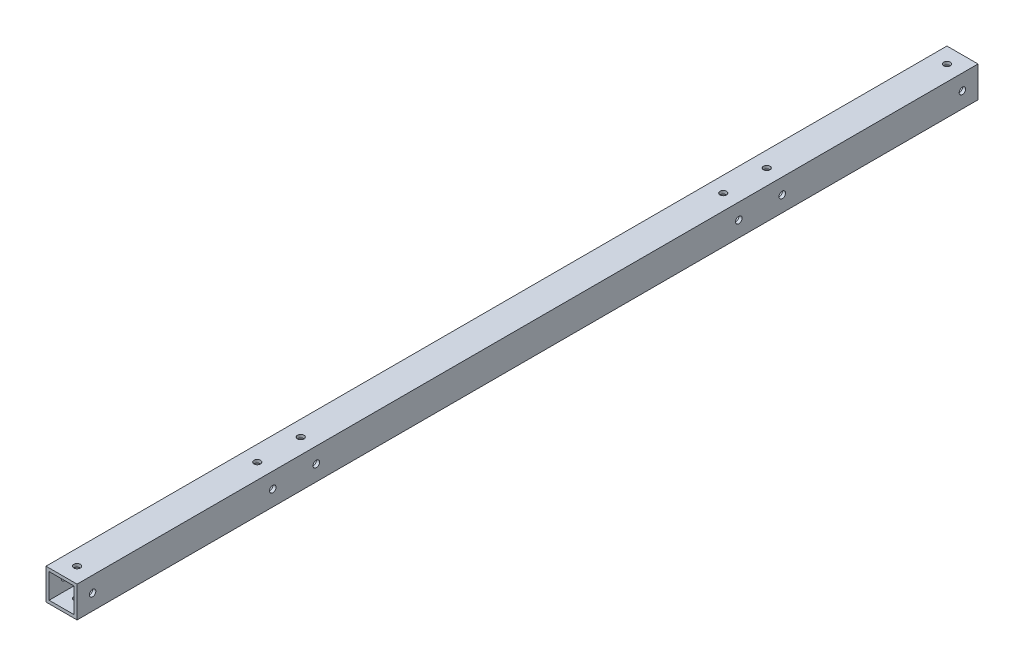
ISO-10303-21;
HEADER;
FILE_DESCRIPTION(('STEP AP214'),'2;1');
FILE_NAME('part.step','',(''),(''),'','','');
FILE_SCHEMA(('AUTOMOTIVE_DESIGN { 1 0 10303 214 1 1 1 1 }'));
ENDSEC;
DATA;
#1=APPLICATION_CONTEXT('core data for automotive mechanical design processes');
#2=APPLICATION_PROTOCOL_DEFINITION('international standard','automotive_design',2000,#1);
#3=PRODUCT_CONTEXT('',#1,'mechanical');
#4=PRODUCT('Part','Part','',(#3));
#5=PRODUCT_RELATED_PRODUCT_CATEGORY('part','',(#4));
#6=PRODUCT_DEFINITION_FORMATION('','',#4);
#7=PRODUCT_DEFINITION_CONTEXT('part definition',#1,'design');
#8=PRODUCT_DEFINITION('design','',#6,#7);
#9=PRODUCT_DEFINITION_SHAPE('','',#8);
#10=(LENGTH_UNIT() NAMED_UNIT(*) SI_UNIT(.MILLI.,.METRE.));
#11=(NAMED_UNIT(*) PLANE_ANGLE_UNIT() SI_UNIT($,.RADIAN.));
#12=(NAMED_UNIT(*) SI_UNIT($,.STERADIAN.) SOLID_ANGLE_UNIT());
#13=UNCERTAINTY_MEASURE_WITH_UNIT(LENGTH_MEASURE(1.E-05),#10,'distance_accuracy_value','');
#14=(GEOMETRIC_REPRESENTATION_CONTEXT(3) GLOBAL_UNCERTAINTY_ASSIGNED_CONTEXT((#13)) GLOBAL_UNIT_ASSIGNED_CONTEXT((#10,
#11,#12)) REPRESENTATION_CONTEXT('',''));
#15=CARTESIAN_POINT('',(0.,0.,0.));
#16=DIRECTION('',(0.,0.,1.));
#17=DIRECTION('',(1.,0.,0.));
#18=AXIS2_PLACEMENT_3D('',#15,#16,#17);
#19=CARTESIAN_POINT('',(0.,-10.,580.));
#20=DIRECTION('',(0.,1.,0.));
#21=DIRECTION('',(0.,0.,1.));
#22=AXIS2_PLACEMENT_3D('',#19,#20,#21);
#23=PLANE('',#22);
#24=CARTESIAN_POINT('',(0.,-10.,570.));
#25=DIRECTION('',(0.,-1.,0.));
#26=DIRECTION('',(0.,0.,-1.));
#27=AXIS2_PLACEMENT_3D('',#24,#25,#26);
#28=CIRCLE('',#27,2.1);
#29=CARTESIAN_POINT('',(0.,-10.,567.9));
#30=VERTEX_POINT('',#29);
#31=EDGE_CURVE('E209',#30,#30,#28,.T.);
#32=ORIENTED_EDGE('',*,*,#31,.F.);
#33=EDGE_LOOP('',(#32));
#34=FACE_BOUND('',#33,.T.);
#35=CARTESIAN_POINT('',(0.,-10.,454.));
#36=DIRECTION('',(0.,-1.,0.));
#37=DIRECTION('',(0.,0.,-1.));
#38=AXIS2_PLACEMENT_3D('',#35,#36,#37);
#39=CIRCLE('',#38,2.1);
#40=CARTESIAN_POINT('',(0.,-10.,451.9));
#41=VERTEX_POINT('',#40);
#42=EDGE_CURVE('E436',#41,#41,#39,.T.);
#43=ORIENTED_EDGE('',*,*,#42,.F.);
#44=EDGE_LOOP('',(#43));
#45=FACE_BOUND('',#44,.T.);
#46=CARTESIAN_POINT('',(0.,-10.,426.));
#47=DIRECTION('',(0.,-1.,0.));
#48=DIRECTION('',(0.,0.,-1.));
#49=AXIS2_PLACEMENT_3D('',#46,#47,#48);
#50=CIRCLE('',#49,2.1);
#51=CARTESIAN_POINT('',(0.,-10.,423.9));
#52=VERTEX_POINT('',#51);
#53=EDGE_CURVE('E443',#52,#52,#50,.T.);
#54=ORIENTED_EDGE('',*,*,#53,.F.);
#55=EDGE_LOOP('',(#54));
#56=FACE_BOUND('',#55,.T.);
#57=CARTESIAN_POINT('',(0.,-10.,10.));
#58=DIRECTION('',(0.,1.,0.));
#59=DIRECTION('',(0.,0.,1.));
#60=AXIS2_PLACEMENT_3D('',#57,#58,#59);
#61=CIRCLE('',#60,2.1);
#62=CARTESIAN_POINT('',(0.,-10.,12.1));
#63=VERTEX_POINT('',#62);
#64=EDGE_CURVE('E195',#63,#63,#61,.T.);
#65=ORIENTED_EDGE('',*,*,#64,.T.);
#66=EDGE_LOOP('',(#65));
#67=FACE_BOUND('',#66,.T.);
#68=CARTESIAN_POINT('',(0.,-10.,126.));
#69=DIRECTION('',(0.,1.,0.));
#70=DIRECTION('',(0.,0.,1.));
#71=AXIS2_PLACEMENT_3D('',#68,#69,#70);
#72=CIRCLE('',#71,2.1);
#73=CARTESIAN_POINT('',(0.,-10.,128.1));
#74=VERTEX_POINT('',#73);
#75=EDGE_CURVE('E244',#74,#74,#72,.T.);
#76=ORIENTED_EDGE('',*,*,#75,.T.);
#77=EDGE_LOOP('',(#76));
#78=FACE_BOUND('',#77,.T.);
#79=CARTESIAN_POINT('',(0.,-10.,154.));
#80=DIRECTION('',(0.,1.,0.));
#81=DIRECTION('',(0.,0.,1.));
#82=AXIS2_PLACEMENT_3D('',#79,#80,#81);
#83=CIRCLE('',#82,2.1);
#84=CARTESIAN_POINT('',(0.,-10.,156.1));
#85=VERTEX_POINT('',#84);
#86=EDGE_CURVE('E232',#85,#85,#83,.T.);
#87=ORIENTED_EDGE('',*,*,#86,.T.);
#88=EDGE_LOOP('',(#87));
#89=FACE_BOUND('',#88,.T.);
#90=DIRECTION('',(1.,0.,0.));
#91=VECTOR('',#90,1.);
#92=CARTESIAN_POINT('',(0.,-10.,0.));
#93=LINE('',#92,#91);
#94=CARTESIAN_POINT('',(-10.,-10.,0.));
#95=VERTEX_POINT('',#94);
#96=CARTESIAN_POINT('',(10.,-10.,0.));
#97=VERTEX_POINT('',#96);
#98=EDGE_CURVE('E162',#95,#97,#93,.T.);
#99=ORIENTED_EDGE('',*,*,#98,.T.);
#100=DIRECTION('',(0.,0.,-1.));
#101=VECTOR('',#100,1.);
#102=CARTESIAN_POINT('',(10.,-10.,580.));
#103=LINE('',#102,#101);
#104=CARTESIAN_POINT('',(10.,-10.,580.));
#105=VERTEX_POINT('',#104);
#106=EDGE_CURVE('E11',#105,#97,#103,.T.);
#107=ORIENTED_EDGE('',*,*,#106,.F.);
#108=DIRECTION('',(1.,0.,0.));
#109=VECTOR('',#108,1.);
#110=CARTESIAN_POINT('',(0.,-10.,580.));
#111=LINE('',#110,#109);
#112=CARTESIAN_POINT('',(-10.,-10.,580.));
#113=VERTEX_POINT('',#112);
#114=EDGE_CURVE('E125',#113,#105,#111,.T.);
#115=ORIENTED_EDGE('',*,*,#114,.F.);
#116=DIRECTION('',(0.,0.,-1.));
#117=VECTOR('',#116,1.);
#118=CARTESIAN_POINT('',(-10.,-10.,580.));
#119=LINE('',#118,#117);
#120=EDGE_CURVE('E64',#113,#95,#119,.T.);
#121=ORIENTED_EDGE('',*,*,#120,.T.);
#122=EDGE_LOOP('',(#99,#107,#115,#121));
#123=FACE_BOUND('',#122,.T.);
#124=ADVANCED_FACE('F44',(#34,#45,#56,#67,#78,#89,#123),#23,.F.);
#125=CARTESIAN_POINT('',(10.,0.,580.));
#126=DIRECTION('',(-1.,0.,0.));
#127=DIRECTION('',(0.,0.,1.));
#128=AXIS2_PLACEMENT_3D('',#125,#126,#127);
#129=PLANE('',#128);
#130=CARTESIAN_POINT('',(10.,0.,570.));
#131=DIRECTION('',(1.,0.,0.));
#132=DIRECTION('',(0.,0.,-1.));
#133=AXIS2_PLACEMENT_3D('',#130,#131,#132);
#134=CIRCLE('',#133,2.10000000000004);
#135=CARTESIAN_POINT('',(10.,0.,567.9));
#136=VERTEX_POINT('',#135);
#137=EDGE_CURVE('E710',#136,#136,#134,.T.);
#138=ORIENTED_EDGE('',*,*,#137,.F.);
#139=EDGE_LOOP('',(#138));
#140=FACE_BOUND('',#139,.T.);
#141=CARTESIAN_POINT('',(10.,0.,154.));
#142=DIRECTION('',(1.,0.,0.));
#143=DIRECTION('',(0.,0.,1.));
#144=AXIS2_PLACEMENT_3D('',#141,#142,#143);
#145=CIRCLE('',#144,2.09999999999999);
#146=CARTESIAN_POINT('',(10.,0.,156.1));
#147=VERTEX_POINT('',#146);
#148=EDGE_CURVE('E742',#147,#147,#145,.T.);
#149=ORIENTED_EDGE('',*,*,#148,.F.);
#150=EDGE_LOOP('',(#149));
#151=FACE_BOUND('',#150,.T.);
#152=CARTESIAN_POINT('',(10.,0.,10.));
#153=DIRECTION('',(1.,0.,0.));
#154=DIRECTION('',(0.,0.,-1.));
#155=AXIS2_PLACEMENT_3D('',#152,#153,#154);
#156=CIRCLE('',#155,2.1);
#157=CARTESIAN_POINT('',(10.,0.,7.9));
#158=VERTEX_POINT('',#157);
#159=EDGE_CURVE('E746',#158,#158,#156,.T.);
#160=ORIENTED_EDGE('',*,*,#159,.F.);
#161=EDGE_LOOP('',(#160));
#162=FACE_BOUND('',#161,.T.);
#163=CARTESIAN_POINT('',(10.,0.,426.));
#164=DIRECTION('',(1.,0.,0.));
#165=DIRECTION('',(0.,0.,-1.));
#166=AXIS2_PLACEMENT_3D('',#163,#164,#165);
#167=CIRCLE('',#166,2.09999999999999);
#168=CARTESIAN_POINT('',(10.,0.,423.9));
#169=VERTEX_POINT('',#168);
#170=EDGE_CURVE('E751',#169,#169,#167,.T.);
#171=ORIENTED_EDGE('',*,*,#170,.F.);
#172=EDGE_LOOP('',(#171));
#173=FACE_BOUND('',#172,.T.);
#174=CARTESIAN_POINT('',(10.,0.,454.));
#175=DIRECTION('',(1.,0.,0.));
#176=DIRECTION('',(0.,0.,-1.));
#177=AXIS2_PLACEMENT_3D('',#174,#175,#176);
#178=CIRCLE('',#177,2.09999999999999);
#179=CARTESIAN_POINT('',(10.,0.,451.9));
#180=VERTEX_POINT('',#179);
#181=EDGE_CURVE('E739',#180,#180,#178,.T.);
#182=ORIENTED_EDGE('',*,*,#181,.F.);
#183=EDGE_LOOP('',(#182));
#184=FACE_BOUND('',#183,.T.);
#185=CARTESIAN_POINT('',(10.,0.,126.));
#186=DIRECTION('',(1.,0.,0.));
#187=DIRECTION('',(0.,0.,1.));
#188=AXIS2_PLACEMENT_3D('',#185,#186,#187);
#189=CIRCLE('',#188,2.09999999999999);
#190=CARTESIAN_POINT('',(10.,0.,128.1));
#191=VERTEX_POINT('',#190);
#192=EDGE_CURVE('E730',#191,#191,#189,.T.);
#193=ORIENTED_EDGE('',*,*,#192,.F.);
#194=EDGE_LOOP('',(#193));
#195=FACE_BOUND('',#194,.T.);
#196=DIRECTION('',(0.,1.,0.));
#197=VECTOR('',#196,1.);
#198=CARTESIAN_POINT('',(10.,0.,0.));
#199=LINE('',#198,#197);
#200=CARTESIAN_POINT('',(10.,10.,0.));
#201=VERTEX_POINT('',#200);
#202=EDGE_CURVE('E132',#97,#201,#199,.T.);
#203=ORIENTED_EDGE('',*,*,#202,.T.);
#204=DIRECTION('',(0.,0.,-1.));
#205=VECTOR('',#204,1.);
#206=CARTESIAN_POINT('',(10.,10.,580.));
#207=LINE('',#206,#205);
#208=CARTESIAN_POINT('',(10.,10.,580.));
#209=VERTEX_POINT('',#208);
#210=EDGE_CURVE('E55',#209,#201,#207,.T.);
#211=ORIENTED_EDGE('',*,*,#210,.F.);
#212=DIRECTION('',(0.,1.,0.));
#213=VECTOR('',#212,1.);
#214=CARTESIAN_POINT('',(10.,0.,580.));
#215=LINE('',#214,#213);
#216=EDGE_CURVE('E119',#105,#209,#215,.T.);
#217=ORIENTED_EDGE('',*,*,#216,.F.);
#218=ORIENTED_EDGE('',*,*,#106,.T.);
#219=EDGE_LOOP('',(#203,#211,#217,#218));
#220=FACE_BOUND('',#219,.T.);
#221=ADVANCED_FACE('F131',(#140,#151,#162,#173,#184,#195,#220),#129,.F.);
#222=CARTESIAN_POINT('',(0.,10.,580.));
#223=DIRECTION('',(0.,1.,0.));
#224=DIRECTION('',(0.,0.,1.));
#225=AXIS2_PLACEMENT_3D('',#222,#223,#224);
#226=PLANE('',#225);
#227=CARTESIAN_POINT('',(0.,10.,570.));
#228=DIRECTION('',(0.,-1.,0.));
#229=DIRECTION('',(0.,0.,-1.));
#230=AXIS2_PLACEMENT_3D('',#227,#228,#229);
#231=CIRCLE('',#230,2.1);
#232=CARTESIAN_POINT('',(0.,10.,567.9));
#233=VERTEX_POINT('',#232);
#234=EDGE_CURVE('E432',#233,#233,#231,.T.);
#235=ORIENTED_EDGE('',*,*,#234,.T.);
#236=EDGE_LOOP('',(#235));
#237=FACE_BOUND('',#236,.T.);
#238=CARTESIAN_POINT('',(0.,10.,454.));
#239=DIRECTION('',(0.,-1.,0.));
#240=DIRECTION('',(0.,0.,-1.));
#241=AXIS2_PLACEMENT_3D('',#238,#239,#240);
#242=CIRCLE('',#241,2.1);
#243=CARTESIAN_POINT('',(0.,10.,451.9));
#244=VERTEX_POINT('',#243);
#245=EDGE_CURVE('E440',#244,#244,#242,.T.);
#246=ORIENTED_EDGE('',*,*,#245,.T.);
#247=EDGE_LOOP('',(#246));
#248=FACE_BOUND('',#247,.T.);
#249=CARTESIAN_POINT('',(0.,10.,426.));
#250=DIRECTION('',(0.,-1.,0.));
#251=DIRECTION('',(0.,0.,-1.));
#252=AXIS2_PLACEMENT_3D('',#249,#250,#251);
#253=CIRCLE('',#252,2.1);
#254=CARTESIAN_POINT('',(0.,10.,423.9));
#255=VERTEX_POINT('',#254);
#256=EDGE_CURVE('E225',#255,#255,#253,.T.);
#257=ORIENTED_EDGE('',*,*,#256,.T.);
#258=EDGE_LOOP('',(#257));
#259=FACE_BOUND('',#258,.T.);
#260=CARTESIAN_POINT('',(0.,10.,10.));
#261=DIRECTION('',(0.,1.,0.));
#262=DIRECTION('',(0.,0.,1.));
#263=AXIS2_PLACEMENT_3D('',#260,#261,#262);
#264=CIRCLE('',#263,2.1);
#265=CARTESIAN_POINT('',(0.,10.,12.1));
#266=VERTEX_POINT('',#265);
#267=EDGE_CURVE('E236',#266,#266,#264,.T.);
#268=ORIENTED_EDGE('',*,*,#267,.F.);
#269=EDGE_LOOP('',(#268));
#270=FACE_BOUND('',#269,.T.);
#271=CARTESIAN_POINT('',(0.,10.,126.));
#272=DIRECTION('',(0.,1.,0.));
#273=DIRECTION('',(0.,0.,1.));
#274=AXIS2_PLACEMENT_3D('',#271,#272,#273);
#275=CIRCLE('',#274,2.1);
#276=CARTESIAN_POINT('',(0.,10.,128.1));
#277=VERTEX_POINT('',#276);
#278=EDGE_CURVE('E240',#277,#277,#275,.T.);
#279=ORIENTED_EDGE('',*,*,#278,.F.);
#280=EDGE_LOOP('',(#279));
#281=FACE_BOUND('',#280,.T.);
#282=CARTESIAN_POINT('',(0.,10.,154.));
#283=DIRECTION('',(0.,1.,0.));
#284=DIRECTION('',(0.,0.,1.));
#285=AXIS2_PLACEMENT_3D('',#282,#283,#284);
#286=CIRCLE('',#285,2.1);
#287=CARTESIAN_POINT('',(0.,10.,156.1));
#288=VERTEX_POINT('',#287);
#289=EDGE_CURVE('E248',#288,#288,#286,.T.);
#290=ORIENTED_EDGE('',*,*,#289,.F.);
#291=EDGE_LOOP('',(#290));
#292=FACE_BOUND('',#291,.T.);
#293=DIRECTION('',(1.,0.,0.));
#294=VECTOR('',#293,1.);
#295=CARTESIAN_POINT('',(0.,10.,0.));
#296=LINE('',#295,#294);
#297=CARTESIAN_POINT('',(-10.,10.,0.));
#298=VERTEX_POINT('',#297);
#299=EDGE_CURVE('E167',#298,#201,#296,.T.);
#300=ORIENTED_EDGE('',*,*,#299,.F.);
#301=DIRECTION('',(0.,0.,-1.));
#302=VECTOR('',#301,1.);
#303=CARTESIAN_POINT('',(-10.,10.,580.));
#304=LINE('',#303,#302);
#305=CARTESIAN_POINT('',(-10.,10.,580.));
#306=VERTEX_POINT('',#305);
#307=EDGE_CURVE('E90',#306,#298,#304,.T.);
#308=ORIENTED_EDGE('',*,*,#307,.F.);
#309=DIRECTION('',(1.,0.,0.));
#310=VECTOR('',#309,1.);
#311=CARTESIAN_POINT('',(0.,10.,580.));
#312=LINE('',#311,#310);
#313=EDGE_CURVE('E124',#306,#209,#312,.T.);
#314=ORIENTED_EDGE('',*,*,#313,.T.);
#315=ORIENTED_EDGE('',*,*,#210,.T.);
#316=EDGE_LOOP('',(#300,#308,#314,#315));
#317=FACE_BOUND('',#316,.T.);
#318=ADVANCED_FACE('F137',(#237,#248,#259,#270,#281,#292,#317),#226,.T.);
#319=CARTESIAN_POINT('',(8.,0.,580.));
#320=DIRECTION('',(-1.,0.,0.));
#321=DIRECTION('',(0.,0.,1.));
#322=AXIS2_PLACEMENT_3D('',#319,#320,#321);
#323=PLANE('',#322);
#324=CARTESIAN_POINT('',(8.,0.,570.));
#325=DIRECTION('',(-1.,0.,0.));
#326=DIRECTION('',(0.,0.,1.));
#327=AXIS2_PLACEMENT_3D('',#324,#325,#326);
#328=CIRCLE('',#327,2.10000000000004);
#329=CARTESIAN_POINT('',(8.,0.,572.1));
#330=VERTEX_POINT('',#329);
#331=EDGE_CURVE('E418',#330,#330,#328,.T.);
#332=ORIENTED_EDGE('',*,*,#331,.F.);
#333=EDGE_LOOP('',(#332));
#334=FACE_BOUND('',#333,.T.);
#335=CARTESIAN_POINT('',(8.,0.,154.));
#336=DIRECTION('',(-1.,0.,0.));
#337=DIRECTION('',(0.,0.,1.));
#338=AXIS2_PLACEMENT_3D('',#335,#336,#337);
#339=CIRCLE('',#338,2.09999999999999);
#340=CARTESIAN_POINT('',(8.,0.,156.1));
#341=VERTEX_POINT('',#340);
#342=EDGE_CURVE('E419',#341,#341,#339,.T.);
#343=ORIENTED_EDGE('',*,*,#342,.F.);
#344=EDGE_LOOP('',(#343));
#345=FACE_BOUND('',#344,.T.);
#346=CARTESIAN_POINT('',(8.,0.,10.));
#347=DIRECTION('',(-1.,0.,0.));
#348=DIRECTION('',(0.,0.,1.));
#349=AXIS2_PLACEMENT_3D('',#346,#347,#348);
#350=CIRCLE('',#349,2.1);
#351=CARTESIAN_POINT('',(8.,0.,12.1));
#352=VERTEX_POINT('',#351);
#353=EDGE_CURVE('E676',#352,#352,#350,.T.);
#354=ORIENTED_EDGE('',*,*,#353,.F.);
#355=EDGE_LOOP('',(#354));
#356=FACE_BOUND('',#355,.T.);
#357=CARTESIAN_POINT('',(8.,0.,426.));
#358=DIRECTION('',(-1.,0.,0.));
#359=DIRECTION('',(0.,0.,1.));
#360=AXIS2_PLACEMENT_3D('',#357,#358,#359);
#361=CIRCLE('',#360,2.09999999999999);
#362=CARTESIAN_POINT('',(8.,0.,428.1));
#363=VERTEX_POINT('',#362);
#364=EDGE_CURVE('E677',#363,#363,#361,.T.);
#365=ORIENTED_EDGE('',*,*,#364,.F.);
#366=EDGE_LOOP('',(#365));
#367=FACE_BOUND('',#366,.T.);
#368=CARTESIAN_POINT('',(8.,0.,454.));
#369=DIRECTION('',(-1.,0.,0.));
#370=DIRECTION('',(0.,0.,1.));
#371=AXIS2_PLACEMENT_3D('',#368,#369,#370);
#372=CIRCLE('',#371,2.09999999999999);
#373=CARTESIAN_POINT('',(8.,0.,456.1));
#374=VERTEX_POINT('',#373);
#375=EDGE_CURVE('E718',#374,#374,#372,.T.);
#376=ORIENTED_EDGE('',*,*,#375,.F.);
#377=EDGE_LOOP('',(#376));
#378=FACE_BOUND('',#377,.T.);
#379=CARTESIAN_POINT('',(8.,0.,126.));
#380=DIRECTION('',(-1.,0.,0.));
#381=DIRECTION('',(0.,0.,1.));
#382=AXIS2_PLACEMENT_3D('',#379,#380,#381);
#383=CIRCLE('',#382,2.09999999999999);
#384=CARTESIAN_POINT('',(8.,0.,128.1));
#385=VERTEX_POINT('',#384);
#386=EDGE_CURVE('E704',#385,#385,#383,.T.);
#387=ORIENTED_EDGE('',*,*,#386,.F.);
#388=EDGE_LOOP('',(#387));
#389=FACE_BOUND('',#388,.T.);
#390=DIRECTION('',(0.,1.,0.));
#391=VECTOR('',#390,1.);
#392=CARTESIAN_POINT('',(8.,0.,0.));
#393=LINE('',#392,#391);
#394=CARTESIAN_POINT('',(8.,-8.,0.));
#395=VERTEX_POINT('',#394);
#396=CARTESIAN_POINT('',(8.,8.,0.));
#397=VERTEX_POINT('',#396);
#398=EDGE_CURVE('E146',#395,#397,#393,.T.);
#399=ORIENTED_EDGE('',*,*,#398,.F.);
#400=DIRECTION('',(0.,0.,-1.));
#401=VECTOR('',#400,1.);
#402=CARTESIAN_POINT('',(8.,-8.,580.));
#403=LINE('',#402,#401);
#404=CARTESIAN_POINT('',(8.,-8.,580.));
#405=VERTEX_POINT('',#404);
#406=EDGE_CURVE('E102',#405,#395,#403,.T.);
#407=ORIENTED_EDGE('',*,*,#406,.F.);
#408=DIRECTION('',(0.,1.,0.));
#409=VECTOR('',#408,1.);
#410=CARTESIAN_POINT('',(8.,0.,580.));
#411=LINE('',#410,#409);
#412=CARTESIAN_POINT('',(8.,8.,580.));
#413=VERTEX_POINT('',#412);
#414=EDGE_CURVE('E174',#405,#413,#411,.T.);
#415=ORIENTED_EDGE('',*,*,#414,.T.);
#416=DIRECTION('',(0.,0.,-1.));
#417=VECTOR('',#416,1.);
#418=CARTESIAN_POINT('',(8.,8.,580.));
#419=LINE('',#418,#417);
#420=EDGE_CURVE('E142',#413,#397,#419,.T.);
#421=ORIENTED_EDGE('',*,*,#420,.T.);
#422=EDGE_LOOP('',(#399,#407,#415,#421));
#423=FACE_BOUND('',#422,.T.);
#424=ADVANCED_FACE('F46',(#334,#345,#356,#367,#378,#389,#423),#323,.T.);
#425=CARTESIAN_POINT('',(0.,-8.,580.));
#426=DIRECTION('',(0.,1.,0.));
#427=DIRECTION('',(0.,0.,1.));
#428=AXIS2_PLACEMENT_3D('',#425,#426,#427);
#429=PLANE('',#428);
#430=CARTESIAN_POINT('',(0.,-8.,570.));
#431=DIRECTION('',(0.,1.,0.));
#432=DIRECTION('',(0.,0.,1.));
#433=AXIS2_PLACEMENT_3D('',#430,#431,#432);
#434=CIRCLE('',#433,2.1);
#435=CARTESIAN_POINT('',(0.,-8.,572.1));
#436=VERTEX_POINT('',#435);
#437=EDGE_CURVE('E228',#436,#436,#434,.F.);
#438=ORIENTED_EDGE('',*,*,#437,.T.);
#439=EDGE_LOOP('',(#438));
#440=FACE_BOUND('',#439,.T.);
#441=CARTESIAN_POINT('',(0.,-8.,454.));
#442=DIRECTION('',(0.,1.,0.));
#443=DIRECTION('',(0.,0.,1.));
#444=AXIS2_PLACEMENT_3D('',#441,#442,#443);
#445=CIRCLE('',#444,2.1);
#446=CARTESIAN_POINT('',(0.,-8.,456.1));
#447=VERTEX_POINT('',#446);
#448=EDGE_CURVE('E213',#447,#447,#445,.F.);
#449=ORIENTED_EDGE('',*,*,#448,.T.);
#450=EDGE_LOOP('',(#449));
#451=FACE_BOUND('',#450,.T.);
#452=CARTESIAN_POINT('',(0.,-8.,426.));
#453=DIRECTION('',(0.,1.,0.));
#454=DIRECTION('',(0.,0.,1.));
#455=AXIS2_PLACEMENT_3D('',#452,#453,#454);
#456=CIRCLE('',#455,2.1);
#457=CARTESIAN_POINT('',(0.,-8.,428.1));
#458=VERTEX_POINT('',#457);
#459=EDGE_CURVE('E208',#458,#458,#456,.F.);
#460=ORIENTED_EDGE('',*,*,#459,.T.);
#461=EDGE_LOOP('',(#460));
#462=FACE_BOUND('',#461,.T.);
#463=CARTESIAN_POINT('',(0.,-8.,10.));
#464=DIRECTION('',(0.,1.,0.));
#465=DIRECTION('',(0.,0.,1.));
#466=AXIS2_PLACEMENT_3D('',#463,#464,#465);
#467=CIRCLE('',#466,2.1);
#468=CARTESIAN_POINT('',(0.,-8.,12.1));
#469=VERTEX_POINT('',#468);
#470=EDGE_CURVE('E151',#469,#469,#467,.T.);
#471=ORIENTED_EDGE('',*,*,#470,.F.);
#472=EDGE_LOOP('',(#471));
#473=FACE_BOUND('',#472,.T.);
#474=CARTESIAN_POINT('',(0.,-8.,126.));
#475=DIRECTION('',(0.,1.,0.));
#476=DIRECTION('',(0.,0.,1.));
#477=AXIS2_PLACEMENT_3D('',#474,#475,#476);
#478=CIRCLE('',#477,2.1);
#479=CARTESIAN_POINT('',(0.,-8.,128.1));
#480=VERTEX_POINT('',#479);
#481=EDGE_CURVE('E200',#480,#480,#478,.T.);
#482=ORIENTED_EDGE('',*,*,#481,.F.);
#483=EDGE_LOOP('',(#482));
#484=FACE_BOUND('',#483,.T.);
#485=CARTESIAN_POINT('',(0.,-8.,154.));
#486=DIRECTION('',(0.,1.,0.));
#487=DIRECTION('',(0.,0.,1.));
#488=AXIS2_PLACEMENT_3D('',#485,#486,#487);
#489=CIRCLE('',#488,2.1);
#490=CARTESIAN_POINT('',(0.,-8.,156.1));
#491=VERTEX_POINT('',#490);
#492=EDGE_CURVE('E194',#491,#491,#489,.T.);
#493=ORIENTED_EDGE('',*,*,#492,.F.);
#494=EDGE_LOOP('',(#493));
#495=FACE_BOUND('',#494,.T.);
#496=DIRECTION('',(1.,0.,0.));
#497=VECTOR('',#496,1.);
#498=CARTESIAN_POINT('',(0.,-8.,0.));
#499=LINE('',#498,#497);
#500=CARTESIAN_POINT('',(-8.,-8.,0.));
#501=VERTEX_POINT('',#500);
#502=EDGE_CURVE('E150',#501,#395,#499,.T.);
#503=ORIENTED_EDGE('',*,*,#502,.F.);
#504=DIRECTION('',(0.,0.,-1.));
#505=VECTOR('',#504,1.);
#506=CARTESIAN_POINT('',(-8.,-8.,580.));
#507=LINE('',#506,#505);
#508=CARTESIAN_POINT('',(-8.,-8.,580.));
#509=VERTEX_POINT('',#508);
#510=EDGE_CURVE('E185',#509,#501,#507,.T.);
#511=ORIENTED_EDGE('',*,*,#510,.F.);
#512=DIRECTION('',(1.,0.,0.));
#513=VECTOR('',#512,1.);
#514=CARTESIAN_POINT('',(0.,-8.,580.));
#515=LINE('',#514,#513);
#516=EDGE_CURVE('E266',#509,#405,#515,.T.);
#517=ORIENTED_EDGE('',*,*,#516,.T.);
#518=ORIENTED_EDGE('',*,*,#406,.T.);
#519=EDGE_LOOP('',(#503,#511,#517,#518));
#520=FACE_BOUND('',#519,.T.);
#521=ADVANCED_FACE('F309',(#440,#451,#462,#473,#484,#495,#520),#429,.T.);
#522=CARTESIAN_POINT('',(-8.,0.,580.));
#523=DIRECTION('',(-1.,0.,0.));
#524=DIRECTION('',(0.,0.,1.));
#525=AXIS2_PLACEMENT_3D('',#522,#523,#524);
#526=PLANE('',#525);
#527=CARTESIAN_POINT('',(-8.,0.,570.));
#528=DIRECTION('',(-1.,0.,0.));
#529=DIRECTION('',(0.,0.,1.));
#530=AXIS2_PLACEMENT_3D('',#527,#528,#529);
#531=CIRCLE('',#530,2.10000000000004);
#532=CARTESIAN_POINT('',(-8.,0.,572.1));
#533=VERTEX_POINT('',#532);
#534=EDGE_CURVE('E416',#533,#533,#531,.T.);
#535=ORIENTED_EDGE('',*,*,#534,.T.);
#536=EDGE_LOOP('',(#535));
#537=FACE_BOUND('',#536,.T.);
#538=CARTESIAN_POINT('',(-8.,0.,154.));
#539=DIRECTION('',(-1.,0.,0.));
#540=DIRECTION('',(0.,0.,1.));
#541=AXIS2_PLACEMENT_3D('',#538,#539,#540);
#542=CIRCLE('',#541,2.09999999999999);
#543=CARTESIAN_POINT('',(-8.,0.,156.1));
#544=VERTEX_POINT('',#543);
#545=EDGE_CURVE('E425',#544,#544,#542,.T.);
#546=ORIENTED_EDGE('',*,*,#545,.T.);
#547=EDGE_LOOP('',(#546));
#548=FACE_BOUND('',#547,.T.);
#549=CARTESIAN_POINT('',(-8.,0.,10.));
#550=DIRECTION('',(-1.,0.,0.));
#551=DIRECTION('',(0.,0.,1.));
#552=AXIS2_PLACEMENT_3D('',#549,#550,#551);
#553=CIRCLE('',#552,2.1);
#554=CARTESIAN_POINT('',(-8.,0.,12.1));
#555=VERTEX_POINT('',#554);
#556=EDGE_CURVE('E673',#555,#555,#553,.T.);
#557=ORIENTED_EDGE('',*,*,#556,.T.);
#558=EDGE_LOOP('',(#557));
#559=FACE_BOUND('',#558,.T.);
#560=CARTESIAN_POINT('',(-8.,0.,426.));
#561=DIRECTION('',(-1.,0.,0.));
#562=DIRECTION('',(0.,0.,1.));
#563=AXIS2_PLACEMENT_3D('',#560,#561,#562);
#564=CIRCLE('',#563,2.09999999999999);
#565=CARTESIAN_POINT('',(-8.,0.,428.1));
#566=VERTEX_POINT('',#565);
#567=EDGE_CURVE('E684',#566,#566,#564,.T.);
#568=ORIENTED_EDGE('',*,*,#567,.T.);
#569=EDGE_LOOP('',(#568));
#570=FACE_BOUND('',#569,.T.);
#571=CARTESIAN_POINT('',(-8.,0.,454.));
#572=DIRECTION('',(-1.,0.,0.));
#573=DIRECTION('',(0.,0.,1.));
#574=AXIS2_PLACEMENT_3D('',#571,#572,#573);
#575=CIRCLE('',#574,2.09999999999999);
#576=CARTESIAN_POINT('',(-8.,0.,456.1));
#577=VERTEX_POINT('',#576);
#578=EDGE_CURVE('E698',#577,#577,#575,.T.);
#579=ORIENTED_EDGE('',*,*,#578,.T.);
#580=EDGE_LOOP('',(#579));
#581=FACE_BOUND('',#580,.T.);
#582=CARTESIAN_POINT('',(-8.,0.,126.));
#583=DIRECTION('',(-1.,0.,0.));
#584=DIRECTION('',(0.,0.,1.));
#585=AXIS2_PLACEMENT_3D('',#582,#583,#584);
#586=CIRCLE('',#585,2.09999999999999);
#587=CARTESIAN_POINT('',(-8.,0.,128.1));
#588=VERTEX_POINT('',#587);
#589=EDGE_CURVE('E701',#588,#588,#586,.T.);
#590=ORIENTED_EDGE('',*,*,#589,.T.);
#591=EDGE_LOOP('',(#590));
#592=FACE_BOUND('',#591,.T.);
#593=DIRECTION('',(0.,1.,0.));
#594=VECTOR('',#593,1.);
#595=CARTESIAN_POINT('',(-8.,0.,0.));
#596=LINE('',#595,#594);
#597=CARTESIAN_POINT('',(-8.,8.,0.));
#598=VERTEX_POINT('',#597);
#599=EDGE_CURVE('E155',#501,#598,#596,.T.);
#600=ORIENTED_EDGE('',*,*,#599,.T.);
#601=DIRECTION('',(0.,0.,-1.));
#602=VECTOR('',#601,1.);
#603=CARTESIAN_POINT('',(-8.,8.,580.));
#604=LINE('',#603,#602);
#605=CARTESIAN_POINT('',(-8.,8.,580.));
#606=VERTEX_POINT('',#605);
#607=EDGE_CURVE('E181',#606,#598,#604,.T.);
#608=ORIENTED_EDGE('',*,*,#607,.F.);
#609=DIRECTION('',(0.,1.,0.));
#610=VECTOR('',#609,1.);
#611=CARTESIAN_POINT('',(-8.,0.,580.));
#612=LINE('',#611,#610);
#613=EDGE_CURVE('E270',#509,#606,#612,.T.);
#614=ORIENTED_EDGE('',*,*,#613,.F.);
#615=ORIENTED_EDGE('',*,*,#510,.T.);
#616=EDGE_LOOP('',(#600,#608,#614,#615));
#617=FACE_BOUND('',#616,.T.);
#618=ADVANCED_FACE('F286',(#537,#548,#559,#570,#581,#592,#617),#526,.F.);
#619=CARTESIAN_POINT('',(0.,8.,580.));
#620=DIRECTION('',(0.,1.,0.));
#621=DIRECTION('',(0.,0.,1.));
#622=AXIS2_PLACEMENT_3D('',#619,#620,#621);
#623=PLANE('',#622);
#624=CARTESIAN_POINT('',(0.,7.99999999999999,570.));
#625=DIRECTION('',(0.,1.,0.));
#626=DIRECTION('',(0.,0.,1.));
#627=AXIS2_PLACEMENT_3D('',#624,#625,#626);
#628=CIRCLE('',#627,2.1);
#629=CARTESIAN_POINT('',(0.,7.99999999999999,572.1));
#630=VERTEX_POINT('',#629);
#631=EDGE_CURVE('E48',#630,#630,#628,.F.);
#632=ORIENTED_EDGE('',*,*,#631,.F.);
#633=EDGE_LOOP('',(#632));
#634=FACE_BOUND('',#633,.T.);
#635=CARTESIAN_POINT('',(0.,7.99999999999999,454.));
#636=DIRECTION('',(0.,1.,0.));
#637=DIRECTION('',(0.,0.,1.));
#638=AXIS2_PLACEMENT_3D('',#635,#636,#637);
#639=CIRCLE('',#638,2.1);
#640=CARTESIAN_POINT('',(0.,7.99999999999999,456.1));
#641=VERTEX_POINT('',#640);
#642=EDGE_CURVE('E210',#641,#641,#639,.F.);
#643=ORIENTED_EDGE('',*,*,#642,.F.);
#644=EDGE_LOOP('',(#643));
#645=FACE_BOUND('',#644,.T.);
#646=CARTESIAN_POINT('',(0.,7.99999999999999,426.));
#647=DIRECTION('',(0.,1.,0.));
#648=DIRECTION('',(0.,0.,1.));
#649=AXIS2_PLACEMENT_3D('',#646,#647,#648);
#650=CIRCLE('',#649,2.1);
#651=CARTESIAN_POINT('',(0.,7.99999999999999,428.1));
#652=VERTEX_POINT('',#651);
#653=EDGE_CURVE('E205',#652,#652,#650,.F.);
#654=ORIENTED_EDGE('',*,*,#653,.F.);
#655=EDGE_LOOP('',(#654));
#656=FACE_BOUND('',#655,.T.);
#657=CARTESIAN_POINT('',(0.,7.99999999999999,10.));
#658=DIRECTION('',(0.,1.,0.));
#659=DIRECTION('',(0.,0.,1.));
#660=AXIS2_PLACEMENT_3D('',#657,#658,#659);
#661=CIRCLE('',#660,2.1);
#662=CARTESIAN_POINT('',(0.,7.99999999999999,12.1));
#663=VERTEX_POINT('',#662);
#664=EDGE_CURVE('E201',#663,#663,#661,.T.);
#665=ORIENTED_EDGE('',*,*,#664,.T.);
#666=EDGE_LOOP('',(#665));
#667=FACE_BOUND('',#666,.T.);
#668=CARTESIAN_POINT('',(0.,7.99999999999999,126.));
#669=DIRECTION('',(0.,1.,0.));
#670=DIRECTION('',(0.,0.,1.));
#671=AXIS2_PLACEMENT_3D('',#668,#669,#670);
#672=CIRCLE('',#671,2.1);
#673=CARTESIAN_POINT('',(0.,7.99999999999999,128.1));
#674=VERTEX_POINT('',#673);
#675=EDGE_CURVE('E196',#674,#674,#672,.T.);
#676=ORIENTED_EDGE('',*,*,#675,.T.);
#677=EDGE_LOOP('',(#676));
#678=FACE_BOUND('',#677,.T.);
#679=CARTESIAN_POINT('',(0.,7.99999999999999,154.));
#680=DIRECTION('',(0.,1.,0.));
#681=DIRECTION('',(0.,0.,1.));
#682=AXIS2_PLACEMENT_3D('',#679,#680,#681);
#683=CIRCLE('',#682,2.1);
#684=CARTESIAN_POINT('',(0.,7.99999999999999,156.1));
#685=VERTEX_POINT('',#684);
#686=EDGE_CURVE('E190',#685,#685,#683,.T.);
#687=ORIENTED_EDGE('',*,*,#686,.T.);
#688=EDGE_LOOP('',(#687));
#689=FACE_BOUND('',#688,.T.);
#690=DIRECTION('',(1.,0.,0.));
#691=VECTOR('',#690,1.);
#692=CARTESIAN_POINT('',(0.,8.,0.));
#693=LINE('',#692,#691);
#694=EDGE_CURVE('E158',#598,#397,#693,.T.);
#695=ORIENTED_EDGE('',*,*,#694,.T.);
#696=ORIENTED_EDGE('',*,*,#420,.F.);
#697=DIRECTION('',(1.,0.,0.));
#698=VECTOR('',#697,1.);
#699=CARTESIAN_POINT('',(0.,8.,580.));
#700=LINE('',#699,#698);
#701=EDGE_CURVE('E273',#606,#413,#700,.T.);
#702=ORIENTED_EDGE('',*,*,#701,.F.);
#703=ORIENTED_EDGE('',*,*,#607,.T.);
#704=EDGE_LOOP('',(#695,#696,#702,#703));
#705=FACE_BOUND('',#704,.T.);
#706=ADVANCED_FACE('F282',(#634,#645,#656,#667,#678,#689,#705),#623,.F.);
#707=CARTESIAN_POINT('',(-10.,0.,580.));
#708=DIRECTION('',(-1.,0.,0.));
#709=DIRECTION('',(0.,0.,1.));
#710=AXIS2_PLACEMENT_3D('',#707,#708,#709);
#711=PLANE('',#710);
#712=CARTESIAN_POINT('',(-10.,0.,570.));
#713=DIRECTION('',(1.,0.,0.));
#714=DIRECTION('',(0.,0.,-1.));
#715=AXIS2_PLACEMENT_3D('',#712,#713,#714);
#716=CIRCLE('',#715,2.10000000000004);
#717=CARTESIAN_POINT('',(-10.,0.,567.9));
#718=VERTEX_POINT('',#717);
#719=EDGE_CURVE('E414',#718,#718,#716,.T.);
#720=ORIENTED_EDGE('',*,*,#719,.T.);
#721=EDGE_LOOP('',(#720));
#722=FACE_BOUND('',#721,.T.);
#723=CARTESIAN_POINT('',(-10.,0.,154.));
#724=DIRECTION('',(1.,0.,0.));
#725=DIRECTION('',(0.,0.,1.));
#726=AXIS2_PLACEMENT_3D('',#723,#724,#725);
#727=CIRCLE('',#726,2.09999999999999);
#728=CARTESIAN_POINT('',(-10.,0.,156.1));
#729=VERTEX_POINT('',#728);
#730=EDGE_CURVE('E764',#729,#729,#727,.T.);
#731=ORIENTED_EDGE('',*,*,#730,.T.);
#732=EDGE_LOOP('',(#731));
#733=FACE_BOUND('',#732,.T.);
#734=CARTESIAN_POINT('',(-10.,0.,10.));
#735=DIRECTION('',(1.,0.,0.));
#736=DIRECTION('',(0.,0.,-1.));
#737=AXIS2_PLACEMENT_3D('',#734,#735,#736);
#738=CIRCLE('',#737,2.1);
#739=CARTESIAN_POINT('',(-10.,0.,7.9));
#740=VERTEX_POINT('',#739);
#741=EDGE_CURVE('E670',#740,#740,#738,.T.);
#742=ORIENTED_EDGE('',*,*,#741,.T.);
#743=EDGE_LOOP('',(#742));
#744=FACE_BOUND('',#743,.T.);
#745=CARTESIAN_POINT('',(-10.,0.,426.));
#746=DIRECTION('',(1.,0.,0.));
#747=DIRECTION('',(0.,0.,-1.));
#748=AXIS2_PLACEMENT_3D('',#745,#746,#747);
#749=CIRCLE('',#748,2.09999999999999);
#750=CARTESIAN_POINT('',(-10.,0.,423.9));
#751=VERTEX_POINT('',#750);
#752=EDGE_CURVE('E713',#751,#751,#749,.T.);
#753=ORIENTED_EDGE('',*,*,#752,.T.);
#754=EDGE_LOOP('',(#753));
#755=FACE_BOUND('',#754,.T.);
#756=CARTESIAN_POINT('',(-10.,0.,454.));
#757=DIRECTION('',(1.,0.,0.));
#758=DIRECTION('',(0.,0.,-1.));
#759=AXIS2_PLACEMENT_3D('',#756,#757,#758);
#760=CIRCLE('',#759,2.09999999999999);
#761=CARTESIAN_POINT('',(-10.,0.,451.9));
#762=VERTEX_POINT('',#761);
#763=EDGE_CURVE('E733',#762,#762,#760,.T.);
#764=ORIENTED_EDGE('',*,*,#763,.T.);
#765=EDGE_LOOP('',(#764));
#766=FACE_BOUND('',#765,.T.);
#767=CARTESIAN_POINT('',(-10.,0.,126.));
#768=DIRECTION('',(1.,0.,0.));
#769=DIRECTION('',(0.,0.,1.));
#770=AXIS2_PLACEMENT_3D('',#767,#768,#769);
#771=CIRCLE('',#770,2.09999999999999);
#772=CARTESIAN_POINT('',(-10.,0.,128.1));
#773=VERTEX_POINT('',#772);
#774=EDGE_CURVE('E734',#773,#773,#771,.T.);
#775=ORIENTED_EDGE('',*,*,#774,.T.);
#776=EDGE_LOOP('',(#775));
#777=FACE_BOUND('',#776,.T.);
#778=DIRECTION('',(0.,1.,0.));
#779=VECTOR('',#778,1.);
#780=CARTESIAN_POINT('',(-10.,0.,0.));
#781=LINE('',#780,#779);
#782=EDGE_CURVE('E170',#95,#298,#781,.T.);
#783=ORIENTED_EDGE('',*,*,#782,.F.);
#784=ORIENTED_EDGE('',*,*,#120,.F.);
#785=DIRECTION('',(0.,1.,0.));
#786=VECTOR('',#785,1.);
#787=CARTESIAN_POINT('',(-10.,0.,580.));
#788=LINE('',#787,#786);
#789=EDGE_CURVE('E139',#113,#306,#788,.T.);
#790=ORIENTED_EDGE('',*,*,#789,.T.);
#791=ORIENTED_EDGE('',*,*,#307,.T.);
#792=EDGE_LOOP('',(#783,#784,#790,#791));
#793=FACE_BOUND('',#792,.T.);
#794=ADVANCED_FACE('F285',(#722,#733,#744,#755,#766,#777,#793),#711,.T.);
#795=CARTESIAN_POINT('',(0.,0.,580.));
#796=DIRECTION('',(0.,0.,1.));
#797=DIRECTION('',(1.,0.,0.));
#798=AXIS2_PLACEMENT_3D('',#795,#796,#797);
#799=PLANE('',#798);
#800=ORIENTED_EDGE('',*,*,#414,.F.);
#801=ORIENTED_EDGE('',*,*,#516,.F.);
#802=ORIENTED_EDGE('',*,*,#613,.T.);
#803=ORIENTED_EDGE('',*,*,#701,.T.);
#804=EDGE_LOOP('',(#800,#801,#802,#803));
#805=FACE_BOUND('',#804,.T.);
#806=ORIENTED_EDGE('',*,*,#114,.T.);
#807=ORIENTED_EDGE('',*,*,#216,.T.);
#808=ORIENTED_EDGE('',*,*,#313,.F.);
#809=ORIENTED_EDGE('',*,*,#789,.F.);
#810=EDGE_LOOP('',(#806,#807,#808,#809));
#811=FACE_BOUND('',#810,.T.);
#812=ADVANCED_FACE('F121',(#805,#811),#799,.T.);
#813=CARTESIAN_POINT('',(0.,0.,0.));
#814=DIRECTION('',(0.,0.,1.));
#815=DIRECTION('',(1.,0.,0.));
#816=AXIS2_PLACEMENT_3D('',#813,#814,#815);
#817=PLANE('',#816);
#818=ORIENTED_EDGE('',*,*,#398,.T.);
#819=ORIENTED_EDGE('',*,*,#694,.F.);
#820=ORIENTED_EDGE('',*,*,#599,.F.);
#821=ORIENTED_EDGE('',*,*,#502,.T.);
#822=EDGE_LOOP('',(#818,#819,#820,#821));
#823=FACE_BOUND('',#822,.T.);
#824=ORIENTED_EDGE('',*,*,#98,.F.);
#825=ORIENTED_EDGE('',*,*,#782,.T.);
#826=ORIENTED_EDGE('',*,*,#299,.T.);
#827=ORIENTED_EDGE('',*,*,#202,.F.);
#828=EDGE_LOOP('',(#824,#825,#826,#827));
#829=FACE_BOUND('',#828,.T.);
#830=ADVANCED_FACE('F303',(#823,#829),#817,.F.);
#831=CARTESIAN_POINT('',(0.,-10.,154.));
#832=DIRECTION('',(0.,1.,0.));
#833=DIRECTION('',(0.,0.,1.));
#834=AXIS2_PLACEMENT_3D('',#831,#832,#833);
#835=CYLINDRICAL_SURFACE('',#834,2.1);
#836=ORIENTED_EDGE('',*,*,#289,.T.);
#837=EDGE_LOOP('',(#836));
#838=FACE_BOUND('',#837,.T.);
#839=ORIENTED_EDGE('',*,*,#686,.F.);
#840=EDGE_LOOP('',(#839));
#841=FACE_BOUND('',#840,.T.);
#842=ADVANCED_FACE('F342',(#838,#841),#835,.F.);
#843=CARTESIAN_POINT('',(0.,-10.,126.));
#844=DIRECTION('',(0.,1.,0.));
#845=DIRECTION('',(0.,0.,1.));
#846=AXIS2_PLACEMENT_3D('',#843,#844,#845);
#847=CYLINDRICAL_SURFACE('',#846,2.1);
#848=ORIENTED_EDGE('',*,*,#278,.T.);
#849=EDGE_LOOP('',(#848));
#850=FACE_BOUND('',#849,.T.);
#851=ORIENTED_EDGE('',*,*,#675,.F.);
#852=EDGE_LOOP('',(#851));
#853=FACE_BOUND('',#852,.T.);
#854=ADVANCED_FACE('F355',(#850,#853),#847,.F.);
#855=CARTESIAN_POINT('',(0.,-10.,10.));
#856=DIRECTION('',(0.,1.,0.));
#857=DIRECTION('',(0.,0.,1.));
#858=AXIS2_PLACEMENT_3D('',#855,#856,#857);
#859=CYLINDRICAL_SURFACE('',#858,2.1);
#860=ORIENTED_EDGE('',*,*,#267,.T.);
#861=EDGE_LOOP('',(#860));
#862=FACE_BOUND('',#861,.T.);
#863=ORIENTED_EDGE('',*,*,#664,.F.);
#864=EDGE_LOOP('',(#863));
#865=FACE_BOUND('',#864,.T.);
#866=ADVANCED_FACE('F349',(#862,#865),#859,.F.);
#867=ORIENTED_EDGE('',*,*,#492,.T.);
#868=EDGE_LOOP('',(#867));
#869=FACE_BOUND('',#868,.T.);
#870=ORIENTED_EDGE('',*,*,#86,.F.);
#871=EDGE_LOOP('',(#870));
#872=FACE_BOUND('',#871,.T.);
#873=ADVANCED_FACE('F345',(#869,#872),#835,.F.);
#874=ORIENTED_EDGE('',*,*,#481,.T.);
#875=EDGE_LOOP('',(#874));
#876=FACE_BOUND('',#875,.T.);
#877=ORIENTED_EDGE('',*,*,#75,.F.);
#878=EDGE_LOOP('',(#877));
#879=FACE_BOUND('',#878,.T.);
#880=ADVANCED_FACE('F348',(#876,#879),#847,.F.);
#881=ORIENTED_EDGE('',*,*,#470,.T.);
#882=EDGE_LOOP('',(#881));
#883=FACE_BOUND('',#882,.T.);
#884=ORIENTED_EDGE('',*,*,#64,.F.);
#885=EDGE_LOOP('',(#884));
#886=FACE_BOUND('',#885,.T.);
#887=ADVANCED_FACE('F353',(#883,#886),#859,.F.);
#888=CARTESIAN_POINT('',(0.,-10.,426.));
#889=DIRECTION('',(0.,1.,0.));
#890=DIRECTION('',(0.,0.,1.));
#891=AXIS2_PLACEMENT_3D('',#888,#889,#890);
#892=CYLINDRICAL_SURFACE('',#891,2.1);
#893=ORIENTED_EDGE('',*,*,#256,.F.);
#894=EDGE_LOOP('',(#893));
#895=FACE_BOUND('',#894,.T.);
#896=ORIENTED_EDGE('',*,*,#653,.T.);
#897=EDGE_LOOP('',(#896));
#898=FACE_BOUND('',#897,.T.);
#899=ADVANCED_FACE('F357',(#895,#898),#892,.F.);
#900=CARTESIAN_POINT('',(0.,-10.,454.));
#901=DIRECTION('',(0.,1.,0.));
#902=DIRECTION('',(0.,0.,1.));
#903=AXIS2_PLACEMENT_3D('',#900,#901,#902);
#904=CYLINDRICAL_SURFACE('',#903,2.1);
#905=ORIENTED_EDGE('',*,*,#245,.F.);
#906=EDGE_LOOP('',(#905));
#907=FACE_BOUND('',#906,.T.);
#908=ORIENTED_EDGE('',*,*,#642,.T.);
#909=EDGE_LOOP('',(#908));
#910=FACE_BOUND('',#909,.T.);
#911=ADVANCED_FACE('F368',(#907,#910),#904,.F.);
#912=CARTESIAN_POINT('',(0.,-10.,570.));
#913=DIRECTION('',(0.,1.,0.));
#914=DIRECTION('',(0.,0.,1.));
#915=AXIS2_PLACEMENT_3D('',#912,#913,#914);
#916=CYLINDRICAL_SURFACE('',#915,2.1);
#917=ORIENTED_EDGE('',*,*,#234,.F.);
#918=EDGE_LOOP('',(#917));
#919=FACE_BOUND('',#918,.T.);
#920=ORIENTED_EDGE('',*,*,#631,.T.);
#921=EDGE_LOOP('',(#920));
#922=FACE_BOUND('',#921,.T.);
#923=ADVANCED_FACE('F280',(#919,#922),#916,.F.);
#924=ORIENTED_EDGE('',*,*,#459,.F.);
#925=EDGE_LOOP('',(#924));
#926=FACE_BOUND('',#925,.T.);
#927=ORIENTED_EDGE('',*,*,#53,.T.);
#928=EDGE_LOOP('',(#927));
#929=FACE_BOUND('',#928,.T.);
#930=ADVANCED_FACE('F359',(#926,#929),#892,.F.);
#931=ORIENTED_EDGE('',*,*,#448,.F.);
#932=EDGE_LOOP('',(#931));
#933=FACE_BOUND('',#932,.T.);
#934=ORIENTED_EDGE('',*,*,#42,.T.);
#935=EDGE_LOOP('',(#934));
#936=FACE_BOUND('',#935,.T.);
#937=ADVANCED_FACE('F362',(#933,#936),#904,.F.);
#938=ORIENTED_EDGE('',*,*,#437,.F.);
#939=EDGE_LOOP('',(#938));
#940=FACE_BOUND('',#939,.T.);
#941=ORIENTED_EDGE('',*,*,#31,.T.);
#942=EDGE_LOOP('',(#941));
#943=FACE_BOUND('',#942,.T.);
#944=ADVANCED_FACE('F366',(#940,#943),#916,.F.);
#945=CARTESIAN_POINT('',(-10.,0.,126.));
#946=DIRECTION('',(1.,0.,0.));
#947=DIRECTION('',(0.,0.,-1.));
#948=AXIS2_PLACEMENT_3D('',#945,#946,#947);
#949=CYLINDRICAL_SURFACE('',#948,2.09999999999999);
#950=ORIENTED_EDGE('',*,*,#774,.F.);
#951=EDGE_LOOP('',(#950));
#952=FACE_BOUND('',#951,.T.);
#953=ORIENTED_EDGE('',*,*,#589,.F.);
#954=EDGE_LOOP('',(#953));
#955=FACE_BOUND('',#954,.T.);
#956=ADVANCED_FACE('F371',(#952,#955),#949,.F.);
#957=CARTESIAN_POINT('',(-10.,0.,454.));
#958=DIRECTION('',(1.,0.,0.));
#959=DIRECTION('',(0.,0.,-1.));
#960=AXIS2_PLACEMENT_3D('',#957,#958,#959);
#961=CYLINDRICAL_SURFACE('',#960,2.09999999999999);
#962=ORIENTED_EDGE('',*,*,#763,.F.);
#963=EDGE_LOOP('',(#962));
#964=FACE_BOUND('',#963,.T.);
#965=ORIENTED_EDGE('',*,*,#578,.F.);
#966=EDGE_LOOP('',(#965));
#967=FACE_BOUND('',#966,.T.);
#968=ADVANCED_FACE('F393',(#964,#967),#961,.F.);
#969=CARTESIAN_POINT('',(-10.,0.,426.));
#970=DIRECTION('',(1.,0.,0.));
#971=DIRECTION('',(0.,0.,-1.));
#972=AXIS2_PLACEMENT_3D('',#969,#970,#971);
#973=CYLINDRICAL_SURFACE('',#972,2.09999999999999);
#974=ORIENTED_EDGE('',*,*,#752,.F.);
#975=EDGE_LOOP('',(#974));
#976=FACE_BOUND('',#975,.T.);
#977=ORIENTED_EDGE('',*,*,#567,.F.);
#978=EDGE_LOOP('',(#977));
#979=FACE_BOUND('',#978,.T.);
#980=ADVANCED_FACE('F379',(#976,#979),#973,.F.);
#981=CARTESIAN_POINT('',(-10.,0.,10.));
#982=DIRECTION('',(1.,0.,0.));
#983=DIRECTION('',(0.,0.,-1.));
#984=AXIS2_PLACEMENT_3D('',#981,#982,#983);
#985=CYLINDRICAL_SURFACE('',#984,2.1);
#986=ORIENTED_EDGE('',*,*,#741,.F.);
#987=EDGE_LOOP('',(#986));
#988=FACE_BOUND('',#987,.T.);
#989=ORIENTED_EDGE('',*,*,#556,.F.);
#990=EDGE_LOOP('',(#989));
#991=FACE_BOUND('',#990,.T.);
#992=ADVANCED_FACE('F384',(#988,#991),#985,.F.);
#993=CARTESIAN_POINT('',(-10.,0.,154.));
#994=DIRECTION('',(1.,0.,0.));
#995=DIRECTION('',(0.,0.,-1.));
#996=AXIS2_PLACEMENT_3D('',#993,#994,#995);
#997=CYLINDRICAL_SURFACE('',#996,2.09999999999999);
#998=ORIENTED_EDGE('',*,*,#730,.F.);
#999=EDGE_LOOP('',(#998));
#1000=FACE_BOUND('',#999,.T.);
#1001=ORIENTED_EDGE('',*,*,#545,.F.);
#1002=EDGE_LOOP('',(#1001));
#1003=FACE_BOUND('',#1002,.T.);
#1004=ADVANCED_FACE('F398',(#1000,#1003),#997,.F.);
#1005=CARTESIAN_POINT('',(-10.,0.,570.));
#1006=DIRECTION('',(1.,0.,0.));
#1007=DIRECTION('',(0.,0.,-1.));
#1008=AXIS2_PLACEMENT_3D('',#1005,#1006,#1007);
#1009=CYLINDRICAL_SURFACE('',#1008,2.10000000000004);
#1010=ORIENTED_EDGE('',*,*,#719,.F.);
#1011=EDGE_LOOP('',(#1010));
#1012=FACE_BOUND('',#1011,.T.);
#1013=ORIENTED_EDGE('',*,*,#534,.F.);
#1014=EDGE_LOOP('',(#1013));
#1015=FACE_BOUND('',#1014,.T.);
#1016=ADVANCED_FACE('F388',(#1012,#1015),#1009,.F.);
#1017=ORIENTED_EDGE('',*,*,#386,.T.);
#1018=EDGE_LOOP('',(#1017));
#1019=FACE_BOUND('',#1018,.T.);
#1020=ORIENTED_EDGE('',*,*,#192,.T.);
#1021=EDGE_LOOP('',(#1020));
#1022=FACE_BOUND('',#1021,.T.);
#1023=ADVANCED_FACE('F385',(#1019,#1022),#949,.F.);
#1024=ORIENTED_EDGE('',*,*,#375,.T.);
#1025=EDGE_LOOP('',(#1024));
#1026=FACE_BOUND('',#1025,.T.);
#1027=ORIENTED_EDGE('',*,*,#181,.T.);
#1028=EDGE_LOOP('',(#1027));
#1029=FACE_BOUND('',#1028,.T.);
#1030=ADVANCED_FACE('F377',(#1026,#1029),#961,.F.);
#1031=ORIENTED_EDGE('',*,*,#364,.T.);
#1032=EDGE_LOOP('',(#1031));
#1033=FACE_BOUND('',#1032,.T.);
#1034=ORIENTED_EDGE('',*,*,#170,.T.);
#1035=EDGE_LOOP('',(#1034));
#1036=FACE_BOUND('',#1035,.T.);
#1037=ADVANCED_FACE('F373',(#1033,#1036),#973,.F.);
#1038=ORIENTED_EDGE('',*,*,#353,.T.);
#1039=EDGE_LOOP('',(#1038));
#1040=FACE_BOUND('',#1039,.T.);
#1041=ORIENTED_EDGE('',*,*,#159,.T.);
#1042=EDGE_LOOP('',(#1041));
#1043=FACE_BOUND('',#1042,.T.);
#1044=ADVANCED_FACE('F376',(#1040,#1043),#985,.F.);
#1045=ORIENTED_EDGE('',*,*,#342,.T.);
#1046=EDGE_LOOP('',(#1045));
#1047=FACE_BOUND('',#1046,.T.);
#1048=ORIENTED_EDGE('',*,*,#148,.T.);
#1049=EDGE_LOOP('',(#1048));
#1050=FACE_BOUND('',#1049,.T.);
#1051=ADVANCED_FACE('F382',(#1047,#1050),#997,.F.);
#1052=ORIENTED_EDGE('',*,*,#331,.T.);
#1053=EDGE_LOOP('',(#1052));
#1054=FACE_BOUND('',#1053,.T.);
#1055=ORIENTED_EDGE('',*,*,#137,.T.);
#1056=EDGE_LOOP('',(#1055));
#1057=FACE_BOUND('',#1056,.T.);
#1058=ADVANCED_FACE('F396',(#1054,#1057),#1009,.F.);
#1059=CLOSED_SHELL('',(#124,#221,#318,#424,#521,#618,#706,#794,#812,#830,#842,#854,#866,#873,
#880,#887,#899,#911,#923,#930,#937,#944,#956,#968,#980,#992,#1004,#1016,#1023,#1030,#1037,#1044,
#1051,#1058));
#1060=MANIFOLD_SOLID_BREP('B2',#1059);
#1061=ADVANCED_BREP_SHAPE_REPRESENTATION('',(#18,#1060),#14);
#1062=SHAPE_DEFINITION_REPRESENTATION(#9,#1061);
ENDSEC;
END-ISO-10303-21;
